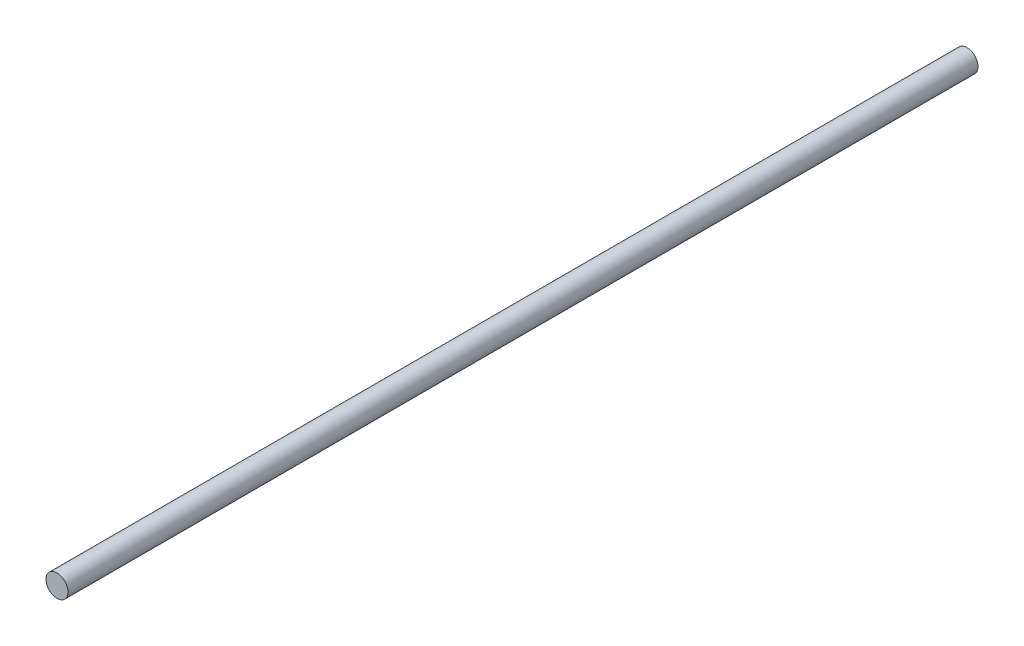
ISO-10303-21;
HEADER;
FILE_DESCRIPTION(('STEP AP214'),'2;1');
FILE_NAME('part.step','',(''),(''),'','','');
FILE_SCHEMA(('AUTOMOTIVE_DESIGN { 1 0 10303 214 1 1 1 1 }'));
ENDSEC;
DATA;
#1=APPLICATION_CONTEXT('core data for automotive mechanical design processes');
#2=APPLICATION_PROTOCOL_DEFINITION('international standard','automotive_design',2000,#1);
#3=PRODUCT_CONTEXT('',#1,'mechanical');
#4=PRODUCT('Part','Part','',(#3));
#5=PRODUCT_RELATED_PRODUCT_CATEGORY('part','',(#4));
#6=PRODUCT_DEFINITION_FORMATION('','',#4);
#7=PRODUCT_DEFINITION_CONTEXT('part definition',#1,'design');
#8=PRODUCT_DEFINITION('design','',#6,#7);
#9=PRODUCT_DEFINITION_SHAPE('','',#8);
#10=(LENGTH_UNIT() NAMED_UNIT(*) SI_UNIT(.MILLI.,.METRE.));
#11=(NAMED_UNIT(*) PLANE_ANGLE_UNIT() SI_UNIT($,.RADIAN.));
#12=(NAMED_UNIT(*) SI_UNIT($,.STERADIAN.) SOLID_ANGLE_UNIT());
#13=UNCERTAINTY_MEASURE_WITH_UNIT(LENGTH_MEASURE(1.E-05),#10,'distance_accuracy_value','');
#14=(GEOMETRIC_REPRESENTATION_CONTEXT(3) GLOBAL_UNCERTAINTY_ASSIGNED_CONTEXT((#13)) GLOBAL_UNIT_ASSIGNED_CONTEXT((#10,
#11,#12)) REPRESENTATION_CONTEXT('',''));
#15=CARTESIAN_POINT('',(0.,0.,0.));
#16=DIRECTION('',(0.,0.,1.));
#17=DIRECTION('',(1.,0.,0.));
#18=AXIS2_PLACEMENT_3D('',#15,#16,#17);
#19=CARTESIAN_POINT('',(-5.98713688873571,4.96448928351687,330.));
#20=DIRECTION('',(0.,0.,-1.));
#21=DIRECTION('',(-1.,0.,0.));
#22=AXIS2_PLACEMENT_3D('',#19,#20,#21);
#23=CYLINDRICAL_SURFACE('',#22,4.);
#24=CARTESIAN_POINT('',(-5.98713688873571,4.96448928351687,330.));
#25=DIRECTION('',(0.,0.,1.));
#26=DIRECTION('',(1.,0.,0.));
#27=AXIS2_PLACEMENT_3D('',#24,#25,#26);
#28=CIRCLE('',#27,4.);
#29=CARTESIAN_POINT('',(-1.98713688873571,4.96448928351687,330.));
#30=VERTEX_POINT('',#29);
#31=EDGE_CURVE('E10',#30,#30,#28,.T.);
#32=ORIENTED_EDGE('',*,*,#31,.F.);
#33=EDGE_LOOP('',(#32));
#34=FACE_BOUND('',#33,.T.);
#35=CARTESIAN_POINT('',(-5.98713688873571,4.96448928351687,0.));
#36=DIRECTION('',(0.,0.,1.));
#37=DIRECTION('',(1.,0.,0.));
#38=AXIS2_PLACEMENT_3D('',#35,#36,#37);
#39=CIRCLE('',#38,4.);
#40=CARTESIAN_POINT('',(-1.98713688873571,4.96448928351687,0.));
#41=VERTEX_POINT('',#40);
#42=EDGE_CURVE('E33',#41,#41,#39,.T.);
#43=ORIENTED_EDGE('',*,*,#42,.T.);
#44=EDGE_LOOP('',(#43));
#45=FACE_BOUND('',#44,.T.);
#46=ADVANCED_FACE('F30',(#34,#45),#23,.T.);
#47=CARTESIAN_POINT('',(-5.98713688873571,4.96448928351687,330.));
#48=DIRECTION('',(0.,0.,1.));
#49=DIRECTION('',(1.,0.,0.));
#50=AXIS2_PLACEMENT_3D('',#47,#48,#49);
#51=PLANE('',#50);
#52=ORIENTED_EDGE('',*,*,#31,.T.);
#53=EDGE_LOOP('',(#52));
#54=FACE_BOUND('',#53,.T.);
#55=ADVANCED_FACE('F45',(#54),#51,.T.);
#56=CARTESIAN_POINT('',(-5.98713688873571,4.96448928351687,0.));
#57=DIRECTION('',(0.,0.,1.));
#58=DIRECTION('',(1.,0.,0.));
#59=AXIS2_PLACEMENT_3D('',#56,#57,#58);
#60=PLANE('',#59);
#61=ORIENTED_EDGE('',*,*,#42,.F.);
#62=EDGE_LOOP('',(#61));
#63=FACE_BOUND('',#62,.T.);
#64=ADVANCED_FACE('F43',(#63),#60,.F.);
#65=CLOSED_SHELL('',(#46,#55,#64));
#66=MANIFOLD_SOLID_BREP('B2',#65);
#67=ADVANCED_BREP_SHAPE_REPRESENTATION('',(#18,#66),#14);
#68=SHAPE_DEFINITION_REPRESENTATION(#9,#67);
ENDSEC;
END-ISO-10303-21;
